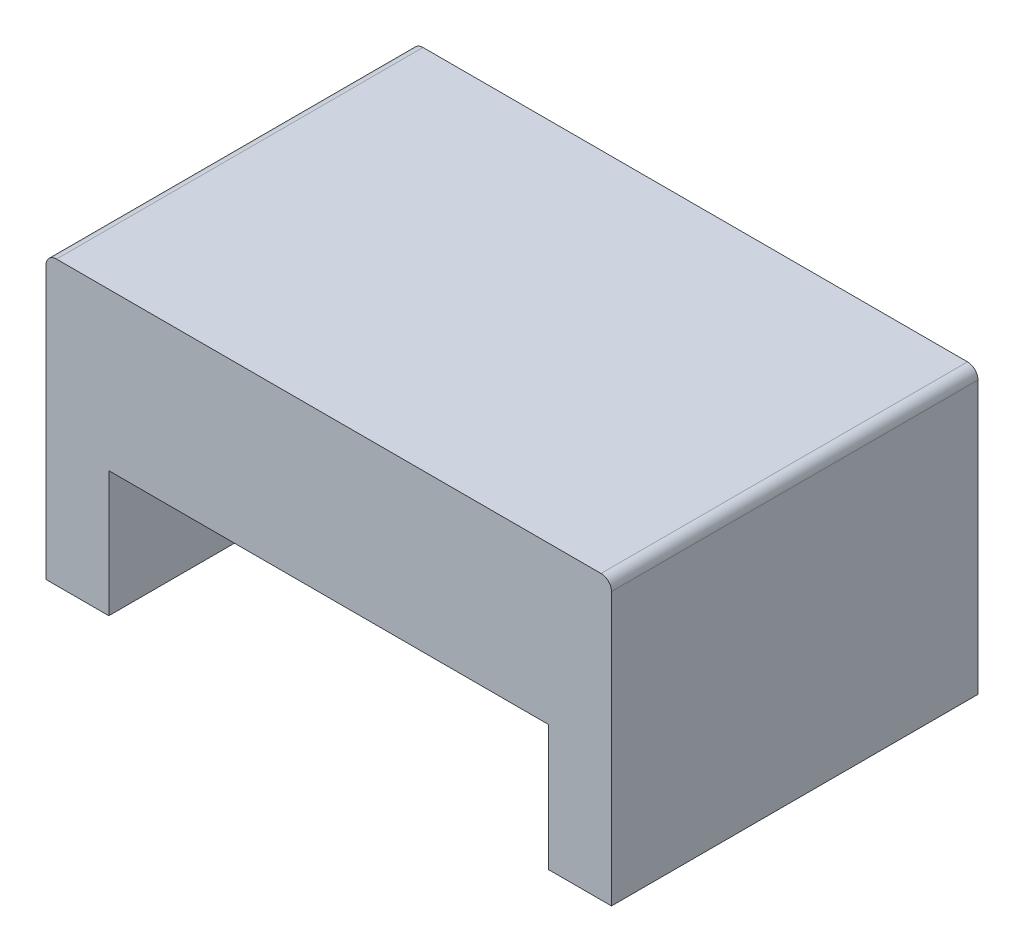
ISO-10303-21;
HEADER;
FILE_DESCRIPTION(('STEP AP214'),'2;1');
FILE_NAME('part.step','',(''),(''),'','','');
FILE_SCHEMA(('AUTOMOTIVE_DESIGN { 1 0 10303 214 1 1 1 1 }'));
ENDSEC;
DATA;
#1=APPLICATION_CONTEXT('core data for automotive mechanical design processes');
#2=APPLICATION_PROTOCOL_DEFINITION('international standard','automotive_design',2000,#1);
#3=PRODUCT_CONTEXT('',#1,'mechanical');
#4=PRODUCT('Part','Part','',(#3));
#5=PRODUCT_RELATED_PRODUCT_CATEGORY('part','',(#4));
#6=PRODUCT_DEFINITION_FORMATION('','',#4);
#7=PRODUCT_DEFINITION_CONTEXT('part definition',#1,'design');
#8=PRODUCT_DEFINITION('design','',#6,#7);
#9=PRODUCT_DEFINITION_SHAPE('','',#8);
#10=(LENGTH_UNIT() NAMED_UNIT(*) SI_UNIT(.MILLI.,.METRE.));
#11=(NAMED_UNIT(*) PLANE_ANGLE_UNIT() SI_UNIT($,.RADIAN.));
#12=(NAMED_UNIT(*) SI_UNIT($,.STERADIAN.) SOLID_ANGLE_UNIT());
#13=UNCERTAINTY_MEASURE_WITH_UNIT(LENGTH_MEASURE(1.E-05),#10,'distance_accuracy_value','');
#14=(GEOMETRIC_REPRESENTATION_CONTEXT(3) GLOBAL_UNCERTAINTY_ASSIGNED_CONTEXT((#13)) GLOBAL_UNIT_ASSIGNED_CONTEXT((#10,
#11,#12)) REPRESENTATION_CONTEXT('',''));
#15=CARTESIAN_POINT('',(0.,0.,0.));
#16=DIRECTION('',(0.,0.,1.));
#17=DIRECTION('',(1.,0.,0.));
#18=AXIS2_PLACEMENT_3D('',#15,#16,#17);
#19=CARTESIAN_POINT('',(-31.340782122905,-16.8812849162013,35.));
#20=DIRECTION('',(0.,1.,0.));
#21=DIRECTION('',(0.,0.,1.));
#22=AXIS2_PLACEMENT_3D('',#19,#20,#21);
#23=PLANE('',#22);
#24=DIRECTION('',(1.,0.,0.));
#25=VECTOR('',#24,1.);
#26=CARTESIAN_POINT('',(-31.340782122905,-16.8812849162013,0.));
#27=LINE('',#26,#25);
#28=CARTESIAN_POINT('',(-31.340782122905,-16.8812849162013,0.));
#29=VERTEX_POINT('',#28);
#30=CARTESIAN_POINT('',(-25.340782122905,-16.8812849162013,0.));
#31=VERTEX_POINT('',#30);
#32=EDGE_CURVE('E134',#29,#31,#27,.T.);
#33=ORIENTED_EDGE('',*,*,#32,.T.);
#34=DIRECTION('',(0.,0.,-1.));
#35=VECTOR('',#34,1.);
#36=CARTESIAN_POINT('',(-25.340782122905,-16.8812849162013,35.));
#37=LINE('',#36,#35);
#38=CARTESIAN_POINT('',(-25.340782122905,-16.8812849162013,35.));
#39=VERTEX_POINT('',#38);
#40=EDGE_CURVE('E117',#39,#31,#37,.T.);
#41=ORIENTED_EDGE('',*,*,#40,.F.);
#42=DIRECTION('',(1.,0.,0.));
#43=VECTOR('',#42,1.);
#44=CARTESIAN_POINT('',(-31.340782122905,-16.8812849162013,35.));
#45=LINE('',#44,#43);
#46=CARTESIAN_POINT('',(-31.340782122905,-16.8812849162013,35.));
#47=VERTEX_POINT('',#46);
#48=EDGE_CURVE('E123',#47,#39,#45,.T.);
#49=ORIENTED_EDGE('',*,*,#48,.F.);
#50=DIRECTION('',(0.,0.,-1.));
#51=VECTOR('',#50,1.);
#52=CARTESIAN_POINT('',(-31.340782122905,-16.8812849162013,35.));
#53=LINE('',#52,#51);
#54=EDGE_CURVE('E181',#47,#29,#53,.T.);
#55=ORIENTED_EDGE('',*,*,#54,.T.);
#56=EDGE_LOOP('',(#33,#41,#49,#55));
#57=FACE_BOUND('',#56,.T.);
#58=ADVANCED_FACE('F33',(#57),#23,.F.);
#59=CARTESIAN_POINT('',(-25.340782122905,-16.8812849162013,35.));
#60=DIRECTION('',(-1.,0.,0.));
#61=DIRECTION('',(0.,0.,1.));
#62=AXIS2_PLACEMENT_3D('',#59,#60,#61);
#63=PLANE('',#62);
#64=DIRECTION('',(0.,1.,0.));
#65=VECTOR('',#64,1.);
#66=CARTESIAN_POINT('',(-25.340782122905,-16.8812849162013,0.));
#67=LINE('',#66,#65);
#68=CARTESIAN_POINT('',(-25.340782122905,-4.8812849162013,0.));
#69=VERTEX_POINT('',#68);
#70=EDGE_CURVE('E197',#31,#69,#67,.T.);
#71=ORIENTED_EDGE('',*,*,#70,.T.);
#72=DIRECTION('',(0.,0.,-1.));
#73=VECTOR('',#72,1.);
#74=CARTESIAN_POINT('',(-25.340782122905,-4.8812849162013,35.));
#75=LINE('',#74,#73);
#76=CARTESIAN_POINT('',(-25.340782122905,-4.8812849162013,35.));
#77=VERTEX_POINT('',#76);
#78=EDGE_CURVE('E120',#77,#69,#75,.T.);
#79=ORIENTED_EDGE('',*,*,#78,.F.);
#80=DIRECTION('',(0.,1.,0.));
#81=VECTOR('',#80,1.);
#82=CARTESIAN_POINT('',(-25.340782122905,-16.8812849162013,35.));
#83=LINE('',#82,#81);
#84=EDGE_CURVE('E113',#39,#77,#83,.T.);
#85=ORIENTED_EDGE('',*,*,#84,.F.);
#86=ORIENTED_EDGE('',*,*,#40,.T.);
#87=EDGE_LOOP('',(#71,#79,#85,#86));
#88=FACE_BOUND('',#87,.T.);
#89=ADVANCED_FACE('F115',(#88),#63,.F.);
#90=CARTESIAN_POINT('',(-25.340782122905,-4.8812849162013,35.));
#91=DIRECTION('',(0.,1.,0.));
#92=DIRECTION('',(-1.,0.,0.));
#93=AXIS2_PLACEMENT_3D('',#90,#91,#92);
#94=PLANE('',#93);
#95=DIRECTION('',(1.,0.,0.));
#96=VECTOR('',#95,1.);
#97=CARTESIAN_POINT('',(-25.340782122905,-4.8812849162013,0.));
#98=LINE('',#97,#96);
#99=CARTESIAN_POINT('',(16.659217877095,-4.8812849162013,0.));
#100=VERTEX_POINT('',#99);
#101=EDGE_CURVE('E196',#69,#100,#98,.T.);
#102=ORIENTED_EDGE('',*,*,#101,.T.);
#103=DIRECTION('',(0.,0.,-1.));
#104=VECTOR('',#103,1.);
#105=CARTESIAN_POINT('',(16.659217877095,-4.8812849162013,35.));
#106=LINE('',#105,#104);
#107=CARTESIAN_POINT('',(16.659217877095,-4.8812849162013,35.));
#108=VERTEX_POINT('',#107);
#109=EDGE_CURVE('E139',#108,#100,#106,.T.);
#110=ORIENTED_EDGE('',*,*,#109,.F.);
#111=DIRECTION('',(1.,0.,0.));
#112=VECTOR('',#111,1.);
#113=CARTESIAN_POINT('',(-25.340782122905,-4.8812849162013,35.));
#114=LINE('',#113,#112);
#115=EDGE_CURVE('E122',#77,#108,#114,.T.);
#116=ORIENTED_EDGE('',*,*,#115,.F.);
#117=ORIENTED_EDGE('',*,*,#78,.T.);
#118=EDGE_LOOP('',(#102,#110,#116,#117));
#119=FACE_BOUND('',#118,.T.);
#120=ADVANCED_FACE('F207',(#119),#94,.F.);
#121=CARTESIAN_POINT('',(16.659217877095,-4.8812849162013,35.));
#122=DIRECTION('',(1.,0.,0.));
#123=DIRECTION('',(0.,0.,-1.));
#124=AXIS2_PLACEMENT_3D('',#121,#122,#123);
#125=PLANE('',#124);
#126=DIRECTION('',(0.,-1.,0.));
#127=VECTOR('',#126,1.);
#128=CARTESIAN_POINT('',(16.659217877095,-4.8812849162013,0.));
#129=LINE('',#128,#127);
#130=CARTESIAN_POINT('',(16.659217877095,-16.8812849162013,0.));
#131=VERTEX_POINT('',#130);
#132=EDGE_CURVE('E176',#100,#131,#129,.T.);
#133=ORIENTED_EDGE('',*,*,#132,.T.);
#134=DIRECTION('',(0.,0.,-1.));
#135=VECTOR('',#134,1.);
#136=CARTESIAN_POINT('',(16.659217877095,-16.8812849162013,35.));
#137=LINE('',#136,#135);
#138=CARTESIAN_POINT('',(16.659217877095,-16.8812849162013,35.));
#139=VERTEX_POINT('',#138);
#140=EDGE_CURVE('E184',#139,#131,#137,.T.);
#141=ORIENTED_EDGE('',*,*,#140,.F.);
#142=DIRECTION('',(0.,-1.,0.));
#143=VECTOR('',#142,1.);
#144=CARTESIAN_POINT('',(16.659217877095,-4.8812849162013,35.));
#145=LINE('',#144,#143);
#146=EDGE_CURVE('E193',#108,#139,#145,.T.);
#147=ORIENTED_EDGE('',*,*,#146,.F.);
#148=ORIENTED_EDGE('',*,*,#109,.T.);
#149=EDGE_LOOP('',(#133,#141,#147,#148));
#150=FACE_BOUND('',#149,.T.);
#151=ADVANCED_FACE('F191',(#150),#125,.F.);
#152=CARTESIAN_POINT('',(16.659217877095,-16.8812849162013,35.));
#153=DIRECTION('',(0.,1.,0.));
#154=DIRECTION('',(0.,0.,1.));
#155=AXIS2_PLACEMENT_3D('',#152,#153,#154);
#156=PLANE('',#155);
#157=DIRECTION('',(1.,0.,0.));
#158=VECTOR('',#157,1.);
#159=CARTESIAN_POINT('',(16.659217877095,-16.8812849162013,0.));
#160=LINE('',#159,#158);
#161=CARTESIAN_POINT('',(22.659217877095,-16.8812849162013,0.));
#162=VERTEX_POINT('',#161);
#163=EDGE_CURVE('E173',#131,#162,#160,.T.);
#164=ORIENTED_EDGE('',*,*,#163,.T.);
#165=DIRECTION('',(0.,0.,-1.));
#166=VECTOR('',#165,1.);
#167=CARTESIAN_POINT('',(22.659217877095,-16.8812849162013,35.));
#168=LINE('',#167,#166);
#169=CARTESIAN_POINT('',(22.659217877095,-16.8812849162013,35.));
#170=VERTEX_POINT('',#169);
#171=EDGE_CURVE('E172',#170,#162,#168,.T.);
#172=ORIENTED_EDGE('',*,*,#171,.F.);
#173=DIRECTION('',(1.,0.,0.));
#174=VECTOR('',#173,1.);
#175=CARTESIAN_POINT('',(16.659217877095,-16.8812849162013,35.));
#176=LINE('',#175,#174);
#177=EDGE_CURVE('E204',#139,#170,#176,.T.);
#178=ORIENTED_EDGE('',*,*,#177,.F.);
#179=ORIENTED_EDGE('',*,*,#140,.T.);
#180=EDGE_LOOP('',(#164,#172,#178,#179));
#181=FACE_BOUND('',#180,.T.);
#182=ADVANCED_FACE('F214',(#181),#156,.F.);
#183=CARTESIAN_POINT('',(22.659217877095,-16.8812849162013,35.));
#184=DIRECTION('',(-1.,0.,0.));
#185=DIRECTION('',(0.,0.,1.));
#186=AXIS2_PLACEMENT_3D('',#183,#184,#185);
#187=PLANE('',#186);
#188=DIRECTION('',(0.,1.,0.));
#189=VECTOR('',#188,1.);
#190=CARTESIAN_POINT('',(22.659217877095,-16.8812849162013,0.));
#191=LINE('',#190,#189);
#192=CARTESIAN_POINT('',(22.659217877095,9.11871508379871,0.));
#193=VERTEX_POINT('',#192);
#194=EDGE_CURVE('E167',#162,#193,#191,.T.);
#195=ORIENTED_EDGE('',*,*,#194,.T.);
#196=DIRECTION('',(0.,0.,-1.));
#197=VECTOR('',#196,1.);
#198=CARTESIAN_POINT('',(22.659217877095,9.11871508379871,35.));
#199=LINE('',#198,#197);
#200=CARTESIAN_POINT('',(22.659217877095,9.11871508379871,35.));
#201=VERTEX_POINT('',#200);
#202=EDGE_CURVE('E56',#193,#201,#199,.F.);
#203=ORIENTED_EDGE('',*,*,#202,.T.);
#204=DIRECTION('',(0.,1.,0.));
#205=VECTOR('',#204,1.);
#206=CARTESIAN_POINT('',(22.659217877095,-16.8812849162013,35.));
#207=LINE('',#206,#205);
#208=EDGE_CURVE('E153',#170,#201,#207,.T.);
#209=ORIENTED_EDGE('',*,*,#208,.F.);
#210=ORIENTED_EDGE('',*,*,#171,.T.);
#211=EDGE_LOOP('',(#195,#203,#209,#210));
#212=FACE_BOUND('',#211,.T.);
#213=ADVANCED_FACE('F170',(#212),#187,.F.);
#214=CARTESIAN_POINT('',(22.659217877095,10.1187150837987,35.));
#215=DIRECTION('',(0.,-1.,0.));
#216=DIRECTION('',(1.,0.,0.));
#217=AXIS2_PLACEMENT_3D('',#214,#215,#216);
#218=PLANE('',#217);
#219=DIRECTION('',(-1.,0.,0.));
#220=VECTOR('',#219,1.);
#221=CARTESIAN_POINT('',(22.659217877095,10.1187150837987,35.));
#222=LINE('',#221,#220);
#223=CARTESIAN_POINT('',(21.659217877095,10.1187150837987,35.));
#224=VERTEX_POINT('',#223);
#225=CARTESIAN_POINT('',(-30.340782122905,10.1187150837987,35.));
#226=VERTEX_POINT('',#225);
#227=EDGE_CURVE('E152',#224,#226,#222,.T.);
#228=ORIENTED_EDGE('',*,*,#227,.F.);
#229=DIRECTION('',(0.,0.,-1.));
#230=VECTOR('',#229,1.);
#231=CARTESIAN_POINT('',(21.659217877095,10.1187150837987,35.));
#232=LINE('',#231,#230);
#233=CARTESIAN_POINT('',(21.659217877095,10.1187150837987,0.));
#234=VERTEX_POINT('',#233);
#235=EDGE_CURVE('E137',#224,#234,#232,.T.);
#236=ORIENTED_EDGE('',*,*,#235,.T.);
#237=DIRECTION('',(-1.,0.,0.));
#238=VECTOR('',#237,1.);
#239=CARTESIAN_POINT('',(22.659217877095,10.1187150837987,0.));
#240=LINE('',#239,#238);
#241=CARTESIAN_POINT('',(-30.340782122905,10.1187150837987,0.));
#242=VERTEX_POINT('',#241);
#243=EDGE_CURVE('E168',#234,#242,#240,.T.);
#244=ORIENTED_EDGE('',*,*,#243,.T.);
#245=DIRECTION('',(0.,0.,-1.));
#246=VECTOR('',#245,1.);
#247=CARTESIAN_POINT('',(-30.340782122905,10.1187150837987,35.));
#248=LINE('',#247,#246);
#249=EDGE_CURVE('E135',#242,#226,#248,.F.);
#250=ORIENTED_EDGE('',*,*,#249,.T.);
#251=EDGE_LOOP('',(#228,#236,#244,#250));
#252=FACE_BOUND('',#251,.T.);
#253=ADVANCED_FACE('F157',(#252),#218,.F.);
#254=CARTESIAN_POINT('',(-31.340782122905,10.1187150837987,35.));
#255=DIRECTION('',(1.,0.,0.));
#256=DIRECTION('',(0.,0.,-1.));
#257=AXIS2_PLACEMENT_3D('',#254,#255,#256);
#258=PLANE('',#257);
#259=DIRECTION('',(0.,-1.,0.));
#260=VECTOR('',#259,1.);
#261=CARTESIAN_POINT('',(-31.340782122905,10.1187150837987,35.));
#262=LINE('',#261,#260);
#263=CARTESIAN_POINT('',(-31.340782122905,9.1187150837987,35.));
#264=VERTEX_POINT('',#263);
#265=EDGE_CURVE('E127',#264,#47,#262,.T.);
#266=ORIENTED_EDGE('',*,*,#265,.F.);
#267=DIRECTION('',(0.,0.,-1.));
#268=VECTOR('',#267,1.);
#269=CARTESIAN_POINT('',(-31.340782122905,9.1187150837987,35.));
#270=LINE('',#269,#268);
#271=CARTESIAN_POINT('',(-31.340782122905,9.1187150837987,0.));
#272=VERTEX_POINT('',#271);
#273=EDGE_CURVE('E11',#264,#272,#270,.T.);
#274=ORIENTED_EDGE('',*,*,#273,.T.);
#275=DIRECTION('',(0.,-1.,0.));
#276=VECTOR('',#275,1.);
#277=CARTESIAN_POINT('',(-31.340782122905,10.1187150837987,0.));
#278=LINE('',#277,#276);
#279=EDGE_CURVE('E131',#272,#29,#278,.T.);
#280=ORIENTED_EDGE('',*,*,#279,.T.);
#281=ORIENTED_EDGE('',*,*,#54,.F.);
#282=EDGE_LOOP('',(#266,#274,#280,#281));
#283=FACE_BOUND('',#282,.T.);
#284=ADVANCED_FACE('F231',(#283),#258,.F.);
#285=CARTESIAN_POINT('',(0.,0.,35.));
#286=DIRECTION('',(0.,0.,1.));
#287=DIRECTION('',(1.,0.,0.));
#288=AXIS2_PLACEMENT_3D('',#285,#286,#287);
#289=PLANE('',#288);
#290=ORIENTED_EDGE('',*,*,#208,.T.);
#291=CARTESIAN_POINT('',(21.659217877095,9.11871508379871,35.));
#292=DIRECTION('',(0.,0.,1.));
#293=DIRECTION('',(1.,0.,0.));
#294=AXIS2_PLACEMENT_3D('',#291,#292,#293);
#295=CIRCLE('',#294,1.);
#296=EDGE_CURVE('E41',#201,#224,#295,.T.);
#297=ORIENTED_EDGE('',*,*,#296,.T.);
#298=ORIENTED_EDGE('',*,*,#227,.T.);
#299=CARTESIAN_POINT('',(-30.340782122905,9.1187150837987,35.));
#300=DIRECTION('',(0.,0.,1.));
#301=DIRECTION('',(1.,0.,0.));
#302=AXIS2_PLACEMENT_3D('',#299,#300,#301);
#303=CIRCLE('',#302,1.);
#304=EDGE_CURVE('E48',#226,#264,#303,.T.);
#305=ORIENTED_EDGE('',*,*,#304,.T.);
#306=ORIENTED_EDGE('',*,*,#265,.T.);
#307=ORIENTED_EDGE('',*,*,#48,.T.);
#308=ORIENTED_EDGE('',*,*,#84,.T.);
#309=ORIENTED_EDGE('',*,*,#115,.T.);
#310=ORIENTED_EDGE('',*,*,#146,.T.);
#311=ORIENTED_EDGE('',*,*,#177,.T.);
#312=EDGE_LOOP('',(#290,#297,#298,#305,#306,#307,#308,#309,#310,#311));
#313=FACE_BOUND('',#312,.T.);
#314=ADVANCED_FACE('F126',(#313),#289,.T.);
#315=CARTESIAN_POINT('',(0.,0.,0.));
#316=DIRECTION('',(0.,0.,1.));
#317=DIRECTION('',(1.,0.,0.));
#318=AXIS2_PLACEMENT_3D('',#315,#316,#317);
#319=PLANE('',#318);
#320=ORIENTED_EDGE('',*,*,#243,.F.);
#321=CARTESIAN_POINT('',(21.659217877095,9.11871508379871,0.));
#322=DIRECTION('',(0.,0.,1.));
#323=DIRECTION('',(1.,0.,0.));
#324=AXIS2_PLACEMENT_3D('',#321,#322,#323);
#325=CIRCLE('',#324,1.);
#326=EDGE_CURVE('E147',#234,#193,#325,.F.);
#327=ORIENTED_EDGE('',*,*,#326,.T.);
#328=ORIENTED_EDGE('',*,*,#194,.F.);
#329=ORIENTED_EDGE('',*,*,#163,.F.);
#330=ORIENTED_EDGE('',*,*,#132,.F.);
#331=ORIENTED_EDGE('',*,*,#101,.F.);
#332=ORIENTED_EDGE('',*,*,#70,.F.);
#333=ORIENTED_EDGE('',*,*,#32,.F.);
#334=ORIENTED_EDGE('',*,*,#279,.F.);
#335=CARTESIAN_POINT('',(-30.340782122905,9.1187150837987,0.));
#336=DIRECTION('',(0.,0.,1.));
#337=DIRECTION('',(1.,0.,0.));
#338=AXIS2_PLACEMENT_3D('',#335,#336,#337);
#339=CIRCLE('',#338,1.);
#340=EDGE_CURVE('E145',#272,#242,#339,.F.);
#341=ORIENTED_EDGE('',*,*,#340,.T.);
#342=EDGE_LOOP('',(#320,#327,#328,#329,#330,#331,#332,#333,#334,#341));
#343=FACE_BOUND('',#342,.T.);
#344=ADVANCED_FACE('F165',(#343),#319,.F.);
#345=CARTESIAN_POINT('',(21.659217877095,9.11871508379871,35.));
#346=DIRECTION('',(0.,0.,-1.));
#347=DIRECTION('',(-1.,0.,0.));
#348=AXIS2_PLACEMENT_3D('',#345,#346,#347);
#349=CYLINDRICAL_SURFACE('',#348,1.);
#350=ORIENTED_EDGE('',*,*,#296,.F.);
#351=ORIENTED_EDGE('',*,*,#202,.F.);
#352=ORIENTED_EDGE('',*,*,#326,.F.);
#353=ORIENTED_EDGE('',*,*,#235,.F.);
#354=EDGE_LOOP('',(#350,#351,#352,#353));
#355=FACE_BOUND('',#354,.T.);
#356=ADVANCED_FACE('F162',(#355),#349,.T.);
#357=CARTESIAN_POINT('',(-30.340782122905,9.1187150837987,35.));
#358=DIRECTION('',(0.,0.,-1.));
#359=DIRECTION('',(-1.,0.,0.));
#360=AXIS2_PLACEMENT_3D('',#357,#358,#359);
#361=CYLINDRICAL_SURFACE('',#360,1.);
#362=ORIENTED_EDGE('',*,*,#304,.F.);
#363=ORIENTED_EDGE('',*,*,#249,.F.);
#364=ORIENTED_EDGE('',*,*,#340,.F.);
#365=ORIENTED_EDGE('',*,*,#273,.F.);
#366=EDGE_LOOP('',(#362,#363,#364,#365));
#367=FACE_BOUND('',#366,.T.);
#368=ADVANCED_FACE('F35',(#367),#361,.T.);
#369=CLOSED_SHELL('',(#58,#89,#120,#151,#182,#213,#253,#284,#314,#344,#356,#368));
#370=MANIFOLD_SOLID_BREP('B2',#369);
#371=ADVANCED_BREP_SHAPE_REPRESENTATION('',(#18,#370),#14);
#372=SHAPE_DEFINITION_REPRESENTATION(#9,#371);
ENDSEC;
END-ISO-10303-21;
